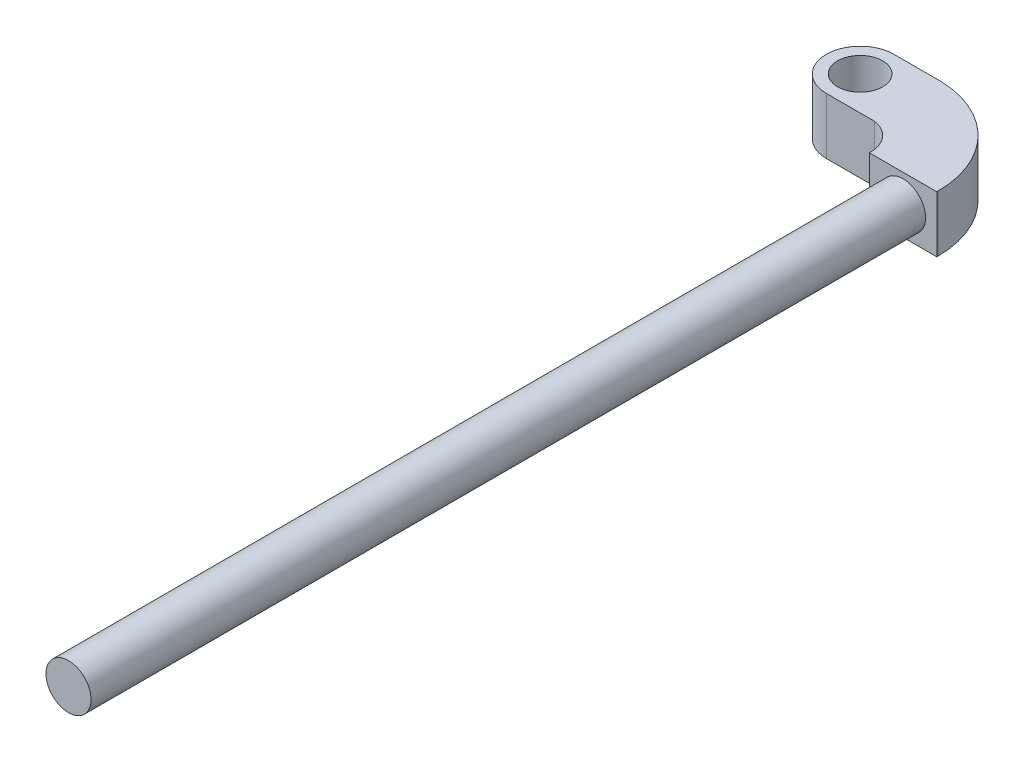
ISO-10303-21;
HEADER;
FILE_DESCRIPTION(('STEP AP214'),'2;1');
FILE_NAME('part.step','',(''),(''),'','','');
FILE_SCHEMA(('AUTOMOTIVE_DESIGN { 1 0 10303 214 1 1 1 1 }'));
ENDSEC;
DATA;
#1=APPLICATION_CONTEXT('core data for automotive mechanical design processes');
#2=APPLICATION_PROTOCOL_DEFINITION('international standard','automotive_design',2000,#1);
#3=PRODUCT_CONTEXT('',#1,'mechanical');
#4=PRODUCT('Part','Part','',(#3));
#5=PRODUCT_RELATED_PRODUCT_CATEGORY('part','',(#4));
#6=PRODUCT_DEFINITION_FORMATION('','',#4);
#7=PRODUCT_DEFINITION_CONTEXT('part definition',#1,'design');
#8=PRODUCT_DEFINITION('design','',#6,#7);
#9=PRODUCT_DEFINITION_SHAPE('','',#8);
#10=(LENGTH_UNIT() NAMED_UNIT(*) SI_UNIT(.MILLI.,.METRE.));
#11=(NAMED_UNIT(*) PLANE_ANGLE_UNIT() SI_UNIT($,.RADIAN.));
#12=(NAMED_UNIT(*) SI_UNIT($,.STERADIAN.) SOLID_ANGLE_UNIT());
#13=UNCERTAINTY_MEASURE_WITH_UNIT(LENGTH_MEASURE(1.E-05),#10,'distance_accuracy_value','');
#14=(GEOMETRIC_REPRESENTATION_CONTEXT(3) GLOBAL_UNCERTAINTY_ASSIGNED_CONTEXT((#13)) GLOBAL_UNIT_ASSIGNED_CONTEXT((#10,
#11,#12)) REPRESENTATION_CONTEXT('',''));
#15=CARTESIAN_POINT('',(0.,0.,0.));
#16=DIRECTION('',(0.,0.,1.));
#17=DIRECTION('',(1.,0.,0.));
#18=AXIS2_PLACEMENT_3D('',#15,#16,#17);
#19=CARTESIAN_POINT('',(-3.93233628488539,5.,0.));
#20=DIRECTION('',(0.,1.,0.));
#21=DIRECTION('',(0.,0.,1.));
#22=AXIS2_PLACEMENT_3D('',#19,#20,#21);
#23=PLANE('',#22);
#24=CARTESIAN_POINT('',(-3.93233628488539,5.,0.));
#25=DIRECTION('',(0.,1.,0.));
#26=DIRECTION('',(0.,0.,1.));
#27=AXIS2_PLACEMENT_3D('',#24,#25,#26);
#28=CIRCLE('',#27,2.);
#29=CARTESIAN_POINT('',(-3.93233628488539,5.,2.));
#30=VERTEX_POINT('',#29);
#31=EDGE_CURVE('E148',#30,#30,#28,.T.);
#32=ORIENTED_EDGE('',*,*,#31,.F.);
#33=EDGE_LOOP('',(#32));
#34=FACE_BOUND('',#33,.T.);
#35=DIRECTION('',(0.,0.,1.));
#36=VECTOR('',#35,1.);
#37=CARTESIAN_POINT('',(2.5376544607165,5.,5.525308020948));
#38=LINE('',#37,#36);
#39=CARTESIAN_POINT('',(2.5376544607165,5.,5.525308020948));
#40=VERTEX_POINT('',#39);
#41=CARTESIAN_POINT('',(2.5376544607165,5.,5.65577860455424));
#42=VERTEX_POINT('',#41);
#43=EDGE_CURVE('E119',#40,#42,#38,.T.);
#44=ORIENTED_EDGE('',*,*,#43,.T.);
#45=DIRECTION('',(1.,0.,0.));
#46=VECTOR('',#45,1.);
#47=CARTESIAN_POINT('',(-3.93233628488539,5.,5.65577860455424));
#48=LINE('',#47,#46);
#49=CARTESIAN_POINT('',(8.52074638519485,5.,5.65577860455424));
#50=VERTEX_POINT('',#49);
#51=EDGE_CURVE('E110',#42,#50,#48,.T.);
#52=ORIENTED_EDGE('',*,*,#51,.T.);
#53=DIRECTION('',(0.,0.,-1.));
#54=VECTOR('',#53,1.);
#55=CARTESIAN_POINT('',(8.52074638519485,5.,8.4296967673376));
#56=LINE('',#55,#54);
#57=CARTESIAN_POINT('',(8.52074638519485,5.,5.525308020948));
#58=VERTEX_POINT('',#57);
#59=EDGE_CURVE('E116',#50,#58,#56,.T.);
#60=ORIENTED_EDGE('',*,*,#59,.T.);
#61=CARTESIAN_POINT('',(-0.0117219870870996,5.,5.525308020948));
#62=DIRECTION('',(0.,1.,0.));
#63=DIRECTION('',(0.,0.,-1.));
#64=AXIS2_PLACEMENT_3D('',#61,#62,#63);
#65=CIRCLE('',#64,8.53246837228195);
#66=CARTESIAN_POINT('',(0.337762879468513,5.,-3.));
#67=VERTEX_POINT('',#66);
#68=EDGE_CURVE('E143',#58,#67,#65,.T.);
#69=ORIENTED_EDGE('',*,*,#68,.T.);
#70=DIRECTION('',(-1.,0.,0.));
#71=VECTOR('',#70,1.);
#72=CARTESIAN_POINT('',(-3.93233628488539,5.,-3.));
#73=LINE('',#72,#71);
#74=CARTESIAN_POINT('',(-3.93233628488539,5.,-3.));
#75=VERTEX_POINT('',#74);
#76=EDGE_CURVE('E61',#67,#75,#73,.T.);
#77=ORIENTED_EDGE('',*,*,#76,.T.);
#78=CARTESIAN_POINT('',(-3.93233628488539,5.,0.));
#79=DIRECTION('',(0.,1.,0.));
#80=DIRECTION('',(0.,0.,1.));
#81=AXIS2_PLACEMENT_3D('',#78,#79,#80);
#82=CIRCLE('',#81,3.);
#83=CARTESIAN_POINT('',(-3.93233628488539,5.,3.));
#84=VERTEX_POINT('',#83);
#85=EDGE_CURVE('E154',#75,#84,#82,.T.);
#86=ORIENTED_EDGE('',*,*,#85,.T.);
#87=DIRECTION('',(1.,0.,0.));
#88=VECTOR('',#87,1.);
#89=CARTESIAN_POINT('',(-3.93233628488539,5.,3.));
#90=LINE('',#89,#88);
#91=CARTESIAN_POINT('',(0.337762879468513,5.,3.));
#92=VERTEX_POINT('',#91);
#93=EDGE_CURVE('E86',#84,#92,#90,.T.);
#94=ORIENTED_EDGE('',*,*,#93,.T.);
#95=CARTESIAN_POINT('',(-0.0117219870870996,5.,5.525308020948));
#96=DIRECTION('',(0.,-1.,0.));
#97=DIRECTION('',(0.,0.,-1.));
#98=AXIS2_PLACEMENT_3D('',#95,#96,#97);
#99=CIRCLE('',#98,2.5493764478036);
#100=EDGE_CURVE('E129',#92,#40,#99,.T.);
#101=ORIENTED_EDGE('',*,*,#100,.T.);
#102=EDGE_LOOP('',(#44,#52,#60,#69,#77,#86,#94,#101));
#103=FACE_BOUND('',#102,.T.);
#104=ADVANCED_FACE('F38',(#34,#103),#23,.T.);
#105=CARTESIAN_POINT('',(-3.93233628488539,0.,0.));
#106=DIRECTION('',(0.,1.,0.));
#107=DIRECTION('',(0.,0.,1.));
#108=AXIS2_PLACEMENT_3D('',#105,#106,#107);
#109=PLANE('',#108);
#110=CARTESIAN_POINT('',(-3.93233628488539,0.,0.));
#111=DIRECTION('',(0.,1.,0.));
#112=DIRECTION('',(0.,0.,1.));
#113=AXIS2_PLACEMENT_3D('',#110,#111,#112);
#114=CIRCLE('',#113,2.);
#115=CARTESIAN_POINT('',(-3.93233628488539,0.,2.));
#116=VERTEX_POINT('',#115);
#117=EDGE_CURVE('E147',#116,#116,#114,.T.);
#118=ORIENTED_EDGE('',*,*,#117,.T.);
#119=EDGE_LOOP('',(#118));
#120=FACE_BOUND('',#119,.T.);
#121=DIRECTION('',(1.,0.,0.));
#122=VECTOR('',#121,1.);
#123=CARTESIAN_POINT('',(-3.93233628488539,0.,5.65577860455424));
#124=LINE('',#123,#122);
#125=CARTESIAN_POINT('',(2.5376544607165,0.,5.65577860455424));
#126=VERTEX_POINT('',#125);
#127=CARTESIAN_POINT('',(8.52074638519485,0.,5.65577860455424));
#128=VERTEX_POINT('',#127);
#129=EDGE_CURVE('E52',#126,#128,#124,.T.);
#130=ORIENTED_EDGE('',*,*,#129,.F.);
#131=DIRECTION('',(0.,0.,1.));
#132=VECTOR('',#131,1.);
#133=CARTESIAN_POINT('',(2.5376544607165,0.,8.4296967673376));
#134=LINE('',#133,#132);
#135=CARTESIAN_POINT('',(2.5376544607165,0.,5.525308020948));
#136=VERTEX_POINT('',#135);
#137=EDGE_CURVE('E139',#136,#126,#134,.T.);
#138=ORIENTED_EDGE('',*,*,#137,.F.);
#139=CARTESIAN_POINT('',(-0.0117219870870996,0.,5.525308020948));
#140=DIRECTION('',(0.,-1.,0.));
#141=DIRECTION('',(0.,0.,-1.));
#142=AXIS2_PLACEMENT_3D('',#139,#140,#141);
#143=CIRCLE('',#142,2.5493764478036);
#144=CARTESIAN_POINT('',(0.337762879468513,0.,3.));
#145=VERTEX_POINT('',#144);
#146=EDGE_CURVE('E136',#145,#136,#143,.T.);
#147=ORIENTED_EDGE('',*,*,#146,.F.);
#148=DIRECTION('',(1.,0.,0.));
#149=VECTOR('',#148,1.);
#150=CARTESIAN_POINT('',(-3.93233628488539,0.,3.));
#151=LINE('',#150,#149);
#152=CARTESIAN_POINT('',(-3.93233628488539,0.,3.));
#153=VERTEX_POINT('',#152);
#154=EDGE_CURVE('E161',#153,#145,#151,.T.);
#155=ORIENTED_EDGE('',*,*,#154,.F.);
#156=CARTESIAN_POINT('',(-3.93233628488539,0.,0.));
#157=DIRECTION('',(0.,1.,0.));
#158=DIRECTION('',(0.,0.,1.));
#159=AXIS2_PLACEMENT_3D('',#156,#157,#158);
#160=CIRCLE('',#159,3.);
#161=CARTESIAN_POINT('',(-3.93233628488539,0.,-3.));
#162=VERTEX_POINT('',#161);
#163=EDGE_CURVE('E151',#162,#153,#160,.T.);
#164=ORIENTED_EDGE('',*,*,#163,.F.);
#165=DIRECTION('',(-1.,0.,0.));
#166=VECTOR('',#165,1.);
#167=CARTESIAN_POINT('',(-3.93233628488539,0.,-3.));
#168=LINE('',#167,#166);
#169=CARTESIAN_POINT('',(0.337762879468513,0.,-3.));
#170=VERTEX_POINT('',#169);
#171=EDGE_CURVE('E78',#170,#162,#168,.T.);
#172=ORIENTED_EDGE('',*,*,#171,.F.);
#173=CARTESIAN_POINT('',(-0.0117219870870996,0.,5.525308020948));
#174=DIRECTION('',(0.,1.,0.));
#175=DIRECTION('',(0.,0.,-1.));
#176=AXIS2_PLACEMENT_3D('',#173,#174,#175);
#177=CIRCLE('',#176,8.53246837228195);
#178=CARTESIAN_POINT('',(8.52074638519485,0.,5.525308020948));
#179=VERTEX_POINT('',#178);
#180=EDGE_CURVE('E133',#179,#170,#177,.T.);
#181=ORIENTED_EDGE('',*,*,#180,.F.);
#182=DIRECTION('',(0.,0.,-1.));
#183=VECTOR('',#182,1.);
#184=CARTESIAN_POINT('',(8.52074638519485,0.,5.525308020948));
#185=LINE('',#184,#183);
#186=EDGE_CURVE('E142',#128,#179,#185,.T.);
#187=ORIENTED_EDGE('',*,*,#186,.F.);
#188=EDGE_LOOP('',(#130,#138,#147,#155,#164,#172,#181,#187));
#189=FACE_BOUND('',#188,.T.);
#190=ADVANCED_FACE('F175',(#120,#189),#109,.F.);
#191=CARTESIAN_POINT('',(2.5376544607165,5.,8.4296967673376));
#192=DIRECTION('',(1.,0.,0.));
#193=DIRECTION('',(0.,0.,-1.));
#194=AXIS2_PLACEMENT_3D('',#191,#192,#193);
#195=PLANE('',#194);
#196=DIRECTION('',(0.,-1.,0.));
#197=VECTOR('',#196,1.);
#198=CARTESIAN_POINT('',(2.5376544607165,5.,5.65577860455424));
#199=LINE('',#198,#197);
#200=EDGE_CURVE('E120',#42,#126,#199,.T.);
#201=ORIENTED_EDGE('',*,*,#200,.F.);
#202=ORIENTED_EDGE('',*,*,#43,.F.);
#203=DIRECTION('',(0.,-1.,0.));
#204=VECTOR('',#203,1.);
#205=CARTESIAN_POINT('',(2.5376544607165,5.,5.525308020948));
#206=LINE('',#205,#204);
#207=EDGE_CURVE('E127',#40,#136,#206,.T.);
#208=ORIENTED_EDGE('',*,*,#207,.T.);
#209=ORIENTED_EDGE('',*,*,#137,.T.);
#210=EDGE_LOOP('',(#201,#202,#208,#209));
#211=FACE_BOUND('',#210,.T.);
#212=ADVANCED_FACE('F183',(#211),#195,.F.);
#213=CARTESIAN_POINT('',(8.52074638519485,5.,5.525308020948));
#214=DIRECTION('',(-1.,0.,0.));
#215=DIRECTION('',(0.,0.,1.));
#216=AXIS2_PLACEMENT_3D('',#213,#214,#215);
#217=PLANE('',#216);
#218=DIRECTION('',(0.,1.,0.));
#219=VECTOR('',#218,1.);
#220=CARTESIAN_POINT('',(8.52074638519485,5.,5.65577860455424));
#221=LINE('',#220,#219);
#222=EDGE_CURVE('E12',#128,#50,#221,.T.);
#223=ORIENTED_EDGE('',*,*,#222,.F.);
#224=ORIENTED_EDGE('',*,*,#186,.T.);
#225=DIRECTION('',(0.,-1.,0.));
#226=VECTOR('',#225,1.);
#227=CARTESIAN_POINT('',(8.52074638519485,5.,5.525308020948));
#228=LINE('',#227,#226);
#229=EDGE_CURVE('E124',#58,#179,#228,.T.);
#230=ORIENTED_EDGE('',*,*,#229,.F.);
#231=ORIENTED_EDGE('',*,*,#59,.F.);
#232=EDGE_LOOP('',(#223,#224,#230,#231));
#233=FACE_BOUND('',#232,.T.);
#234=ADVANCED_FACE('F122',(#233),#217,.F.);
#235=CARTESIAN_POINT('',(-3.93233628488539,5.,0.));
#236=DIRECTION('',(0.,-1.,0.));
#237=DIRECTION('',(0.,0.,-1.));
#238=AXIS2_PLACEMENT_3D('',#235,#236,#237);
#239=CYLINDRICAL_SURFACE('',#238,3.);
#240=ORIENTED_EDGE('',*,*,#163,.T.);
#241=DIRECTION('',(0.,-1.,0.));
#242=VECTOR('',#241,1.);
#243=CARTESIAN_POINT('',(-3.93233628488539,5.,3.));
#244=LINE('',#243,#242);
#245=EDGE_CURVE('E46',#84,#153,#244,.T.);
#246=ORIENTED_EDGE('',*,*,#245,.F.);
#247=ORIENTED_EDGE('',*,*,#85,.F.);
#248=DIRECTION('',(0.,-1.,0.));
#249=VECTOR('',#248,1.);
#250=CARTESIAN_POINT('',(-3.93233628488539,5.,-3.));
#251=LINE('',#250,#249);
#252=EDGE_CURVE('E158',#75,#162,#251,.T.);
#253=ORIENTED_EDGE('',*,*,#252,.T.);
#254=EDGE_LOOP('',(#240,#246,#247,#253));
#255=FACE_BOUND('',#254,.T.);
#256=ADVANCED_FACE('F40',(#255),#239,.T.);
#257=CARTESIAN_POINT('',(-3.93233628488539,5.,3.));
#258=DIRECTION('',(0.,0.,-1.));
#259=DIRECTION('',(-1.,0.,0.));
#260=AXIS2_PLACEMENT_3D('',#257,#258,#259);
#261=PLANE('',#260);
#262=ORIENTED_EDGE('',*,*,#154,.T.);
#263=DIRECTION('',(0.,-1.,0.));
#264=VECTOR('',#263,1.);
#265=CARTESIAN_POINT('',(0.337762879468513,5.,3.));
#266=LINE('',#265,#264);
#267=EDGE_CURVE('E167',#92,#145,#266,.T.);
#268=ORIENTED_EDGE('',*,*,#267,.F.);
#269=ORIENTED_EDGE('',*,*,#93,.F.);
#270=ORIENTED_EDGE('',*,*,#245,.T.);
#271=EDGE_LOOP('',(#262,#268,#269,#270));
#272=FACE_BOUND('',#271,.T.);
#273=ADVANCED_FACE('F170',(#272),#261,.F.);
#274=CARTESIAN_POINT('',(-3.93233628488539,5.,-3.));
#275=DIRECTION('',(0.,0.,1.));
#276=DIRECTION('',(1.,0.,0.));
#277=AXIS2_PLACEMENT_3D('',#274,#275,#276);
#278=PLANE('',#277);
#279=ORIENTED_EDGE('',*,*,#171,.T.);
#280=ORIENTED_EDGE('',*,*,#252,.F.);
#281=ORIENTED_EDGE('',*,*,#76,.F.);
#282=DIRECTION('',(0.,-1.,0.));
#283=VECTOR('',#282,1.);
#284=CARTESIAN_POINT('',(0.337762879468513,5.,-3.));
#285=LINE('',#284,#283);
#286=EDGE_CURVE('E165',#67,#170,#285,.T.);
#287=ORIENTED_EDGE('',*,*,#286,.T.);
#288=EDGE_LOOP('',(#279,#280,#281,#287));
#289=FACE_BOUND('',#288,.T.);
#290=ADVANCED_FACE('F190',(#289),#278,.F.);
#291=CARTESIAN_POINT('',(-3.93233628488539,5.,0.));
#292=DIRECTION('',(0.,-1.,0.));
#293=DIRECTION('',(0.,0.,-1.));
#294=AXIS2_PLACEMENT_3D('',#291,#292,#293);
#295=CYLINDRICAL_SURFACE('',#294,2.);
#296=ORIENTED_EDGE('',*,*,#31,.T.);
#297=EDGE_LOOP('',(#296));
#298=FACE_BOUND('',#297,.T.);
#299=ORIENTED_EDGE('',*,*,#117,.F.);
#300=EDGE_LOOP('',(#299));
#301=FACE_BOUND('',#300,.T.);
#302=ADVANCED_FACE('F192',(#298,#301),#295,.F.);
#303=CARTESIAN_POINT('',(-0.0117219870870996,5.,5.525308020948));
#304=DIRECTION('',(0.,-1.,0.));
#305=DIRECTION('',(0.,0.,-1.));
#306=AXIS2_PLACEMENT_3D('',#303,#304,#305);
#307=CYLINDRICAL_SURFACE('',#306,8.53246837228195);
#308=ORIENTED_EDGE('',*,*,#180,.T.);
#309=ORIENTED_EDGE('',*,*,#286,.F.);
#310=ORIENTED_EDGE('',*,*,#68,.F.);
#311=ORIENTED_EDGE('',*,*,#229,.T.);
#312=EDGE_LOOP('',(#308,#309,#310,#311));
#313=FACE_BOUND('',#312,.T.);
#314=ADVANCED_FACE('F189',(#313),#307,.T.);
#315=CARTESIAN_POINT('',(-0.0117219870870996,5.,5.525308020948));
#316=DIRECTION('',(0.,-1.,0.));
#317=DIRECTION('',(0.,0.,-1.));
#318=AXIS2_PLACEMENT_3D('',#315,#316,#317);
#319=CYLINDRICAL_SURFACE('',#318,2.5493764478036);
#320=ORIENTED_EDGE('',*,*,#146,.T.);
#321=ORIENTED_EDGE('',*,*,#207,.F.);
#322=ORIENTED_EDGE('',*,*,#100,.F.);
#323=ORIENTED_EDGE('',*,*,#267,.T.);
#324=EDGE_LOOP('',(#320,#321,#322,#323));
#325=FACE_BOUND('',#324,.T.);
#326=ADVANCED_FACE('F180',(#325),#319,.F.);
#327=CARTESIAN_POINT('',(0.794205050154729,2.5,5.65577860455424));
#328=DIRECTION('',(0.,0.,1.));
#329=DIRECTION('',(1.,0.,0.));
#330=AXIS2_PLACEMENT_3D('',#327,#328,#329);
#331=PLANE('',#330);
#332=CARTESIAN_POINT('',(5.52920042295568,2.5,5.65577860455424));
#333=DIRECTION('',(0.,0.,1.));
#334=DIRECTION('',(1.,0.,0.));
#335=AXIS2_PLACEMENT_3D('',#332,#333,#334);
#336=CIRCLE('',#335,2.);
#337=CARTESIAN_POINT('',(7.52920042295568,2.5,5.65577860455424));
#338=VERTEX_POINT('',#337);
#339=EDGE_CURVE('E233',#338,#338,#336,.T.);
#340=ORIENTED_EDGE('',*,*,#339,.F.);
#341=EDGE_LOOP('',(#340));
#342=FACE_BOUND('',#341,.T.);
#343=ORIENTED_EDGE('',*,*,#200,.T.);
#344=ORIENTED_EDGE('',*,*,#129,.T.);
#345=ORIENTED_EDGE('',*,*,#222,.T.);
#346=ORIENTED_EDGE('',*,*,#51,.F.);
#347=EDGE_LOOP('',(#343,#344,#345,#346));
#348=FACE_BOUND('',#347,.T.);
#349=ADVANCED_FACE('F109',(#342,#348),#331,.T.);
#350=CARTESIAN_POINT('',(5.52920042295568,2.5,5.65577860455424));
#351=DIRECTION('',(0.,0.,1.));
#352=DIRECTION('',(1.,0.,0.));
#353=AXIS2_PLACEMENT_3D('',#350,#351,#352);
#354=CYLINDRICAL_SURFACE('',#353,2.);
#355=ORIENTED_EDGE('',*,*,#339,.T.);
#356=EDGE_LOOP('',(#355));
#357=FACE_BOUND('',#356,.T.);
#358=CARTESIAN_POINT('',(5.52920042295568,2.5,79.6557786045543));
#359=DIRECTION('',(0.,0.,1.));
#360=DIRECTION('',(1.,0.,0.));
#361=AXIS2_PLACEMENT_3D('',#358,#359,#360);
#362=CIRCLE('',#361,2.);
#363=CARTESIAN_POINT('',(7.52920042295568,2.5,79.6557786045543));
#364=VERTEX_POINT('',#363);
#365=EDGE_CURVE('E236',#364,#364,#362,.T.);
#366=ORIENTED_EDGE('',*,*,#365,.F.);
#367=EDGE_LOOP('',(#366));
#368=FACE_BOUND('',#367,.T.);
#369=ADVANCED_FACE('F219',(#357,#368),#354,.T.);
#370=CARTESIAN_POINT('',(2.5376544607165,5.,79.6557786045543));
#371=DIRECTION('',(0.,0.,-1.));
#372=DIRECTION('',(-1.,0.,0.));
#373=AXIS2_PLACEMENT_3D('',#370,#371,#372);
#374=PLANE('',#373);
#375=ORIENTED_EDGE('',*,*,#365,.T.);
#376=EDGE_LOOP('',(#375));
#377=FACE_BOUND('',#376,.T.);
#378=ADVANCED_FACE('F216',(#377),#374,.F.);
#379=CLOSED_SHELL('',(#104,#190,#212,#234,#256,#273,#290,#302,#314,#326,#349,#369,#378));
#380=MANIFOLD_SOLID_BREP('B2',#379);
#381=ADVANCED_BREP_SHAPE_REPRESENTATION('',(#18,#380),#14);
#382=SHAPE_DEFINITION_REPRESENTATION(#9,#381);
ENDSEC;
END-ISO-10303-21;
